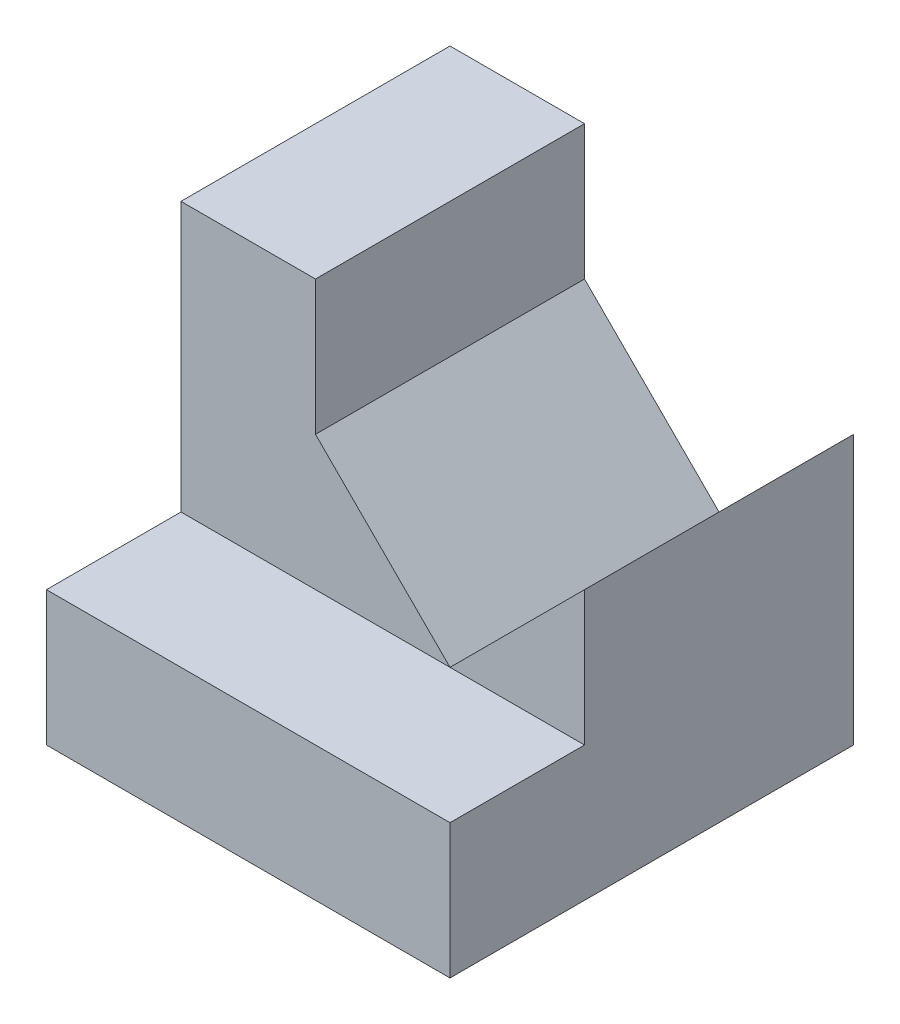
ISO-10303-21;
HEADER;
FILE_DESCRIPTION(('STEP AP214'),'2;1');
FILE_NAME('part.step','',(''),(''),'','','');
FILE_SCHEMA(('AUTOMOTIVE_DESIGN { 1 0 10303 214 1 1 1 1 }'));
ENDSEC;
DATA;
#1=APPLICATION_CONTEXT('core data for automotive mechanical design processes');
#2=APPLICATION_PROTOCOL_DEFINITION('international standard','automotive_design',2000,#1);
#3=PRODUCT_CONTEXT('',#1,'mechanical');
#4=PRODUCT('Part','Part','',(#3));
#5=PRODUCT_RELATED_PRODUCT_CATEGORY('part','',(#4));
#6=PRODUCT_DEFINITION_FORMATION('','',#4);
#7=PRODUCT_DEFINITION_CONTEXT('part definition',#1,'design');
#8=PRODUCT_DEFINITION('design','',#6,#7);
#9=PRODUCT_DEFINITION_SHAPE('','',#8);
#10=(LENGTH_UNIT() NAMED_UNIT(*) SI_UNIT(.MILLI.,.METRE.));
#11=(NAMED_UNIT(*) PLANE_ANGLE_UNIT() SI_UNIT($,.RADIAN.));
#12=(NAMED_UNIT(*) SI_UNIT($,.STERADIAN.) SOLID_ANGLE_UNIT());
#13=UNCERTAINTY_MEASURE_WITH_UNIT(LENGTH_MEASURE(1.E-05),#10,'distance_accuracy_value','');
#14=(GEOMETRIC_REPRESENTATION_CONTEXT(3) GLOBAL_UNCERTAINTY_ASSIGNED_CONTEXT((#13)) GLOBAL_UNIT_ASSIGNED_CONTEXT((#10,
#11,#12)) REPRESENTATION_CONTEXT('',''));
#15=CARTESIAN_POINT('',(0.,0.,0.));
#16=DIRECTION('',(0.,0.,1.));
#17=DIRECTION('',(1.,0.,0.));
#18=AXIS2_PLACEMENT_3D('',#15,#16,#17);
#19=CARTESIAN_POINT('',(0.,0.,-30.));
#20=DIRECTION('',(-1.,0.,0.));
#21=DIRECTION('',(0.,0.,1.));
#22=AXIS2_PLACEMENT_3D('',#19,#20,#21);
#23=PLANE('',#22);
#24=DIRECTION('',(0.,1.,0.));
#25=VECTOR('',#24,1.);
#26=CARTESIAN_POINT('',(0.,0.,-10.));
#27=LINE('',#26,#25);
#28=CARTESIAN_POINT('',(0.,10.,-10.));
#29=VERTEX_POINT('',#28);
#30=CARTESIAN_POINT('',(0.,30.,-10.));
#31=VERTEX_POINT('',#30);
#32=EDGE_CURVE('E121',#29,#31,#27,.T.);
#33=ORIENTED_EDGE('',*,*,#32,.T.);
#34=DIRECTION('',(0.,0.,1.));
#35=VECTOR('',#34,1.);
#36=CARTESIAN_POINT('',(0.,30.,-30.));
#37=LINE('',#36,#35);
#38=CARTESIAN_POINT('',(0.,30.,-30.));
#39=VERTEX_POINT('',#38);
#40=EDGE_CURVE('E40',#39,#31,#37,.T.);
#41=ORIENTED_EDGE('',*,*,#40,.F.);
#42=DIRECTION('',(0.,-1.,0.));
#43=VECTOR('',#42,1.);
#44=CARTESIAN_POINT('',(0.,0.,-30.));
#45=LINE('',#44,#43);
#46=CARTESIAN_POINT('',(0.,0.,-30.));
#47=VERTEX_POINT('',#46);
#48=EDGE_CURVE('E144',#39,#47,#45,.T.);
#49=ORIENTED_EDGE('',*,*,#48,.T.);
#50=DIRECTION('',(0.,0.,1.));
#51=VECTOR('',#50,1.);
#52=CARTESIAN_POINT('',(0.,0.,-30.));
#53=LINE('',#52,#51);
#54=CARTESIAN_POINT('',(0.,0.,0.));
#55=VERTEX_POINT('',#54);
#56=EDGE_CURVE('E75',#47,#55,#53,.T.);
#57=ORIENTED_EDGE('',*,*,#56,.T.);
#58=DIRECTION('',(0.,-1.,0.));
#59=VECTOR('',#58,1.);
#60=CARTESIAN_POINT('',(0.,0.,0.));
#61=LINE('',#60,#59);
#62=CARTESIAN_POINT('',(0.,10.,0.));
#63=VERTEX_POINT('',#62);
#64=EDGE_CURVE('E128',#63,#55,#61,.T.);
#65=ORIENTED_EDGE('',*,*,#64,.F.);
#66=DIRECTION('',(0.,0.,-1.));
#67=VECTOR('',#66,1.);
#68=CARTESIAN_POINT('',(0.,10.,0.));
#69=LINE('',#68,#67);
#70=EDGE_CURVE('E112',#63,#29,#69,.T.);
#71=ORIENTED_EDGE('',*,*,#70,.T.);
#72=EDGE_LOOP('',(#33,#41,#49,#57,#65,#71));
#73=FACE_BOUND('',#72,.T.);
#74=ADVANCED_FACE('F33',(#73),#23,.T.);
#75=CARTESIAN_POINT('',(0.,30.,-30.));
#76=DIRECTION('',(0.,1.,0.));
#77=DIRECTION('',(0.,0.,1.));
#78=AXIS2_PLACEMENT_3D('',#75,#76,#77);
#79=PLANE('',#78);
#80=DIRECTION('',(1.,0.,0.));
#81=VECTOR('',#80,1.);
#82=CARTESIAN_POINT('',(0.,30.,-10.));
#83=LINE('',#82,#81);
#84=CARTESIAN_POINT('',(10.,30.,-10.));
#85=VERTEX_POINT('',#84);
#86=EDGE_CURVE('E176',#31,#85,#83,.T.);
#87=ORIENTED_EDGE('',*,*,#86,.T.);
#88=DIRECTION('',(0.,0.,1.));
#89=VECTOR('',#88,1.);
#90=CARTESIAN_POINT('',(10.,30.,-30.));
#91=LINE('',#90,#89);
#92=CARTESIAN_POINT('',(10.,30.,-30.));
#93=VERTEX_POINT('',#92);
#94=EDGE_CURVE('E134',#93,#85,#91,.T.);
#95=ORIENTED_EDGE('',*,*,#94,.F.);
#96=DIRECTION('',(-1.,0.,0.));
#97=VECTOR('',#96,1.);
#98=CARTESIAN_POINT('',(0.,30.,-30.));
#99=LINE('',#98,#97);
#100=EDGE_CURVE('E56',#93,#39,#99,.T.);
#101=ORIENTED_EDGE('',*,*,#100,.T.);
#102=ORIENTED_EDGE('',*,*,#40,.T.);
#103=EDGE_LOOP('',(#87,#95,#101,#102));
#104=FACE_BOUND('',#103,.T.);
#105=ADVANCED_FACE('F185',(#104),#79,.T.);
#106=CARTESIAN_POINT('',(30.,0.,-30.));
#107=DIRECTION('',(1.,0.,0.));
#108=DIRECTION('',(0.,0.,-1.));
#109=AXIS2_PLACEMENT_3D('',#106,#107,#108);
#110=PLANE('',#109);
#111=DIRECTION('',(0.,1.,0.));
#112=VECTOR('',#111,1.);
#113=CARTESIAN_POINT('',(30.,0.,-10.));
#114=LINE('',#113,#112);
#115=CARTESIAN_POINT('',(30.,10.,-10.));
#116=VERTEX_POINT('',#115);
#117=CARTESIAN_POINT('',(30.,20.,-10.));
#118=VERTEX_POINT('',#117);
#119=EDGE_CURVE('E122',#116,#118,#114,.T.);
#120=ORIENTED_EDGE('',*,*,#119,.F.);
#121=DIRECTION('',(0.,0.,-1.));
#122=VECTOR('',#121,1.);
#123=CARTESIAN_POINT('',(30.,10.,0.));
#124=LINE('',#123,#122);
#125=CARTESIAN_POINT('',(30.,10.,0.));
#126=VERTEX_POINT('',#125);
#127=EDGE_CURVE('E182',#126,#116,#124,.T.);
#128=ORIENTED_EDGE('',*,*,#127,.F.);
#129=DIRECTION('',(0.,1.,0.));
#130=VECTOR('',#129,1.);
#131=CARTESIAN_POINT('',(30.,0.,0.));
#132=LINE('',#131,#130);
#133=CARTESIAN_POINT('',(30.,0.,0.));
#134=VERTEX_POINT('',#133);
#135=EDGE_CURVE('E129',#134,#126,#132,.T.);
#136=ORIENTED_EDGE('',*,*,#135,.F.);
#137=DIRECTION('',(0.,0.,1.));
#138=VECTOR('',#137,1.);
#139=CARTESIAN_POINT('',(30.,0.,-30.));
#140=LINE('',#139,#138);
#141=CARTESIAN_POINT('',(30.,0.,-30.));
#142=VERTEX_POINT('',#141);
#143=EDGE_CURVE('E71',#142,#134,#140,.T.);
#144=ORIENTED_EDGE('',*,*,#143,.F.);
#145=DIRECTION('',(0.,1.,0.));
#146=VECTOR('',#145,1.);
#147=CARTESIAN_POINT('',(30.,0.,-30.));
#148=LINE('',#147,#146);
#149=CARTESIAN_POINT('',(30.,20.,-30.));
#150=VERTEX_POINT('',#149);
#151=EDGE_CURVE('E146',#142,#150,#148,.T.);
#152=ORIENTED_EDGE('',*,*,#151,.T.);
#153=DIRECTION('',(0.,0.,1.));
#154=VECTOR('',#153,1.);
#155=CARTESIAN_POINT('',(30.,20.,-30.));
#156=LINE('',#155,#154);
#157=EDGE_CURVE('E138',#150,#118,#156,.T.);
#158=ORIENTED_EDGE('',*,*,#157,.T.);
#159=EDGE_LOOP('',(#120,#128,#136,#144,#152,#158));
#160=FACE_BOUND('',#159,.T.);
#161=ADVANCED_FACE('F193',(#160),#110,.T.);
#162=CARTESIAN_POINT('',(0.,0.,-30.));
#163=DIRECTION('',(0.,-1.,0.));
#164=DIRECTION('',(0.,0.,-1.));
#165=AXIS2_PLACEMENT_3D('',#162,#163,#164);
#166=PLANE('',#165);
#167=DIRECTION('',(1.,0.,0.));
#168=VECTOR('',#167,1.);
#169=CARTESIAN_POINT('',(0.,0.,0.));
#170=LINE('',#169,#168);
#171=EDGE_CURVE('E133',#55,#134,#170,.T.);
#172=ORIENTED_EDGE('',*,*,#171,.F.);
#173=ORIENTED_EDGE('',*,*,#56,.F.);
#174=DIRECTION('',(1.,0.,0.));
#175=VECTOR('',#174,1.);
#176=CARTESIAN_POINT('',(0.,0.,-30.));
#177=LINE('',#176,#175);
#178=EDGE_CURVE('E148',#47,#142,#177,.T.);
#179=ORIENTED_EDGE('',*,*,#178,.T.);
#180=ORIENTED_EDGE('',*,*,#143,.T.);
#181=EDGE_LOOP('',(#172,#173,#179,#180));
#182=FACE_BOUND('',#181,.T.);
#183=ADVANCED_FACE('F191',(#182),#166,.T.);
#184=CARTESIAN_POINT('',(0.,0.,-30.));
#185=DIRECTION('',(0.,0.,-1.));
#186=DIRECTION('',(-1.,0.,0.));
#187=AXIS2_PLACEMENT_3D('',#184,#185,#186);
#188=PLANE('',#187);
#189=DIRECTION('',(0.,-1.,0.));
#190=VECTOR('',#189,1.);
#191=CARTESIAN_POINT('',(10.,0.,-30.));
#192=LINE('',#191,#190);
#193=CARTESIAN_POINT('',(10.,20.,-30.));
#194=VERTEX_POINT('',#193);
#195=EDGE_CURVE('E168',#93,#194,#192,.T.);
#196=ORIENTED_EDGE('',*,*,#195,.T.);
#197=DIRECTION('',(0.707106781186548,-0.707106781186548,0.));
#198=VECTOR('',#197,1.);
#199=CARTESIAN_POINT('',(15.,15.,-30.));
#200=LINE('',#199,#198);
#201=CARTESIAN_POINT('',(20.,10.,-30.));
#202=VERTEX_POINT('',#201);
#203=EDGE_CURVE('E165',#194,#202,#200,.T.);
#204=ORIENTED_EDGE('',*,*,#203,.T.);
#205=DIRECTION('',(0.707106781186548,0.707106781186547,0.));
#206=VECTOR('',#205,1.);
#207=CARTESIAN_POINT('',(4.99999999999999,-4.99999999999999,-30.));
#208=LINE('',#207,#206);
#209=EDGE_CURVE('E159',#202,#150,#208,.T.);
#210=ORIENTED_EDGE('',*,*,#209,.T.);
#211=ORIENTED_EDGE('',*,*,#151,.F.);
#212=ORIENTED_EDGE('',*,*,#178,.F.);
#213=ORIENTED_EDGE('',*,*,#48,.F.);
#214=ORIENTED_EDGE('',*,*,#100,.F.);
#215=EDGE_LOOP('',(#196,#204,#210,#211,#212,#213,#214));
#216=FACE_BOUND('',#215,.T.);
#217=ADVANCED_FACE('F190',(#216),#188,.T.);
#218=CARTESIAN_POINT('',(0.,0.,0.));
#219=DIRECTION('',(0.,0.,-1.));
#220=DIRECTION('',(-1.,0.,0.));
#221=AXIS2_PLACEMENT_3D('',#218,#219,#220);
#222=PLANE('',#221);
#223=ORIENTED_EDGE('',*,*,#135,.T.);
#224=DIRECTION('',(1.,0.,0.));
#225=VECTOR('',#224,1.);
#226=CARTESIAN_POINT('',(0.,10.,0.));
#227=LINE('',#226,#225);
#228=EDGE_CURVE('E116',#63,#126,#227,.T.);
#229=ORIENTED_EDGE('',*,*,#228,.F.);
#230=ORIENTED_EDGE('',*,*,#64,.T.);
#231=ORIENTED_EDGE('',*,*,#171,.T.);
#232=EDGE_LOOP('',(#223,#229,#230,#231));
#233=FACE_BOUND('',#232,.T.);
#234=ADVANCED_FACE('F126',(#233),#222,.F.);
#235=CARTESIAN_POINT('',(10.,0.,-30.));
#236=DIRECTION('',(-1.,0.,0.));
#237=DIRECTION('',(0.,0.,1.));
#238=AXIS2_PLACEMENT_3D('',#235,#236,#237);
#239=PLANE('',#238);
#240=ORIENTED_EDGE('',*,*,#94,.T.);
#241=DIRECTION('',(0.,-1.,0.));
#242=VECTOR('',#241,1.);
#243=CARTESIAN_POINT('',(10.,0.,-10.));
#244=LINE('',#243,#242);
#245=CARTESIAN_POINT('',(10.,20.,-10.));
#246=VERTEX_POINT('',#245);
#247=EDGE_CURVE('E171',#85,#246,#244,.T.);
#248=ORIENTED_EDGE('',*,*,#247,.T.);
#249=DIRECTION('',(0.,0.,1.));
#250=VECTOR('',#249,1.);
#251=CARTESIAN_POINT('',(10.,20.,-30.));
#252=LINE('',#251,#250);
#253=EDGE_CURVE('E155',#194,#246,#252,.T.);
#254=ORIENTED_EDGE('',*,*,#253,.F.);
#255=ORIENTED_EDGE('',*,*,#195,.F.);
#256=EDGE_LOOP('',(#240,#248,#254,#255));
#257=FACE_BOUND('',#256,.T.);
#258=ADVANCED_FACE('F187',(#257),#239,.F.);
#259=CARTESIAN_POINT('',(4.99999999999999,-4.99999999999999,-30.));
#260=DIRECTION('',(0.707106781186547,-0.707106781186548,0.));
#261=DIRECTION('',(0.707106781186548,0.707106781186547,0.));
#262=AXIS2_PLACEMENT_3D('',#259,#260,#261);
#263=PLANE('',#262);
#264=DIRECTION('',(0.,0.,1.));
#265=VECTOR('',#264,1.);
#266=CARTESIAN_POINT('',(20.,10.,-30.));
#267=LINE('',#266,#265);
#268=CARTESIAN_POINT('',(20.,10.,-10.));
#269=VERTEX_POINT('',#268);
#270=EDGE_CURVE('E158',#202,#269,#267,.T.);
#271=ORIENTED_EDGE('',*,*,#270,.T.);
#272=DIRECTION('',(0.707106781186548,0.707106781186547,0.));
#273=VECTOR('',#272,1.);
#274=CARTESIAN_POINT('',(4.99999999999999,-4.99999999999999,-10.));
#275=LINE('',#274,#273);
#276=EDGE_CURVE('E174',#269,#118,#275,.T.);
#277=ORIENTED_EDGE('',*,*,#276,.T.);
#278=ORIENTED_EDGE('',*,*,#157,.F.);
#279=ORIENTED_EDGE('',*,*,#209,.F.);
#280=EDGE_LOOP('',(#271,#277,#278,#279));
#281=FACE_BOUND('',#280,.T.);
#282=ADVANCED_FACE('F212',(#281),#263,.F.);
#283=CARTESIAN_POINT('',(15.,15.,-30.));
#284=DIRECTION('',(-0.707106781186547,-0.707106781186547,0.));
#285=DIRECTION('',(0.707106781186548,-0.707106781186548,0.));
#286=AXIS2_PLACEMENT_3D('',#283,#284,#285);
#287=PLANE('',#286);
#288=ORIENTED_EDGE('',*,*,#253,.T.);
#289=DIRECTION('',(0.707106781186548,-0.707106781186548,0.));
#290=VECTOR('',#289,1.);
#291=CARTESIAN_POINT('',(15.,15.,-10.));
#292=LINE('',#291,#290);
#293=EDGE_CURVE('E11',#246,#269,#292,.T.);
#294=ORIENTED_EDGE('',*,*,#293,.T.);
#295=ORIENTED_EDGE('',*,*,#270,.F.);
#296=ORIENTED_EDGE('',*,*,#203,.F.);
#297=EDGE_LOOP('',(#288,#294,#295,#296));
#298=FACE_BOUND('',#297,.T.);
#299=ADVANCED_FACE('F213',(#298),#287,.F.);
#300=CARTESIAN_POINT('',(0.,0.,-10.));
#301=DIRECTION('',(0.,0.,-1.));
#302=DIRECTION('',(-1.,0.,0.));
#303=AXIS2_PLACEMENT_3D('',#300,#301,#302);
#304=PLANE('',#303);
#305=ORIENTED_EDGE('',*,*,#86,.F.);
#306=ORIENTED_EDGE('',*,*,#32,.F.);
#307=DIRECTION('',(1.,0.,0.));
#308=VECTOR('',#307,1.);
#309=CARTESIAN_POINT('',(0.,10.,-10.));
#310=LINE('',#309,#308);
#311=EDGE_CURVE('E47',#29,#269,#310,.T.);
#312=ORIENTED_EDGE('',*,*,#311,.T.);
#313=ORIENTED_EDGE('',*,*,#293,.F.);
#314=ORIENTED_EDGE('',*,*,#247,.F.);
#315=EDGE_LOOP('',(#305,#306,#312,#313,#314));
#316=FACE_BOUND('',#315,.T.);
#317=ADVANCED_FACE('F216',(#316),#304,.F.);
#318=EDGE_CURVE('E130',#269,#116,#310,.T.);
#319=ORIENTED_EDGE('',*,*,#318,.T.);
#320=ORIENTED_EDGE('',*,*,#119,.T.);
#321=ORIENTED_EDGE('',*,*,#276,.F.);
#322=EDGE_LOOP('',(#319,#320,#321));
#323=FACE_BOUND('',#322,.T.);
#324=ADVANCED_FACE('F223',(#323),#304,.F.);
#325=CARTESIAN_POINT('',(0.,10.,0.));
#326=DIRECTION('',(0.,-1.,0.));
#327=DIRECTION('',(0.,0.,-1.));
#328=AXIS2_PLACEMENT_3D('',#325,#326,#327);
#329=PLANE('',#328);
#330=ORIENTED_EDGE('',*,*,#311,.F.);
#331=ORIENTED_EDGE('',*,*,#70,.F.);
#332=ORIENTED_EDGE('',*,*,#228,.T.);
#333=ORIENTED_EDGE('',*,*,#127,.T.);
#334=ORIENTED_EDGE('',*,*,#318,.F.);
#335=EDGE_LOOP('',(#330,#331,#332,#333,#334));
#336=FACE_BOUND('',#335,.T.);
#337=ADVANCED_FACE('F114',(#336),#329,.F.);
#338=CLOSED_SHELL('',(#74,#105,#161,#183,#217,#234,#258,#282,#299,#317,#324,#337));
#339=MANIFOLD_SOLID_BREP('B2',#338);
#340=ADVANCED_BREP_SHAPE_REPRESENTATION('',(#18,#339),#14);
#341=SHAPE_DEFINITION_REPRESENTATION(#9,#340);
ENDSEC;
END-ISO-10303-21;
